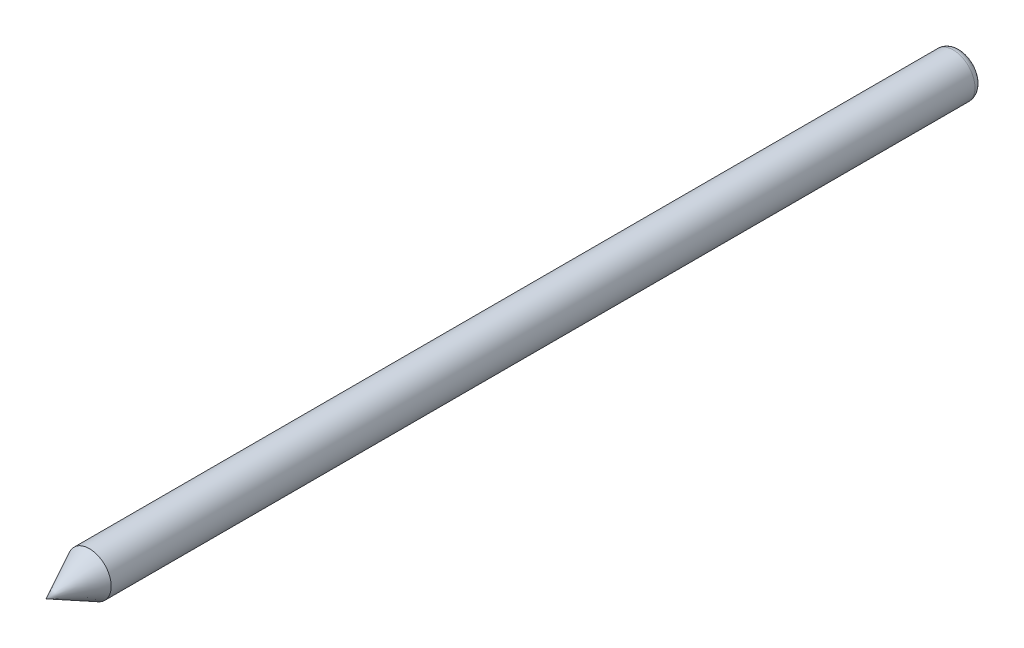
ISO-10303-21;
HEADER;
FILE_DESCRIPTION(('STEP AP214'),'2;1');
FILE_NAME('part.step','',(''),(''),'','','');
FILE_SCHEMA(('AUTOMOTIVE_DESIGN { 1 0 10303 214 1 1 1 1 }'));
ENDSEC;
DATA;
#1=APPLICATION_CONTEXT('core data for automotive mechanical design processes');
#2=APPLICATION_PROTOCOL_DEFINITION('international standard','automotive_design',2000,#1);
#3=PRODUCT_CONTEXT('',#1,'mechanical');
#4=PRODUCT('Part','Part','',(#3));
#5=PRODUCT_RELATED_PRODUCT_CATEGORY('part','',(#4));
#6=PRODUCT_DEFINITION_FORMATION('','',#4);
#7=PRODUCT_DEFINITION_CONTEXT('part definition',#1,'design');
#8=PRODUCT_DEFINITION('design','',#6,#7);
#9=PRODUCT_DEFINITION_SHAPE('','',#8);
#10=(LENGTH_UNIT() NAMED_UNIT(*) SI_UNIT(.MILLI.,.METRE.));
#11=(NAMED_UNIT(*) PLANE_ANGLE_UNIT() SI_UNIT($,.RADIAN.));
#12=(NAMED_UNIT(*) SI_UNIT($,.STERADIAN.) SOLID_ANGLE_UNIT());
#13=UNCERTAINTY_MEASURE_WITH_UNIT(LENGTH_MEASURE(1.E-05),#10,'distance_accuracy_value','');
#14=(GEOMETRIC_REPRESENTATION_CONTEXT(3) GLOBAL_UNCERTAINTY_ASSIGNED_CONTEXT((#13)) GLOBAL_UNIT_ASSIGNED_CONTEXT((#10,
#11,#12)) REPRESENTATION_CONTEXT('',''));
#15=CARTESIAN_POINT('',(0.,0.,0.));
#16=DIRECTION('',(0.,0.,1.));
#17=DIRECTION('',(1.,0.,0.));
#18=AXIS2_PLACEMENT_3D('',#15,#16,#17);
#19=CARTESIAN_POINT('',(0.,0.,120.));
#20=DIRECTION('',(0.,0.,-1.));
#21=DIRECTION('',(-1.,0.,0.));
#22=AXIS2_PLACEMENT_3D('',#19,#20,#21);
#23=CYLINDRICAL_SURFACE('',#22,3.);
#24=CARTESIAN_POINT('',(0.,0.,1.));
#25=DIRECTION('',(0.,0.,1.));
#26=DIRECTION('',(1.,0.,0.));
#27=AXIS2_PLACEMENT_3D('',#24,#25,#26);
#28=CIRCLE('',#27,3.);
#29=CARTESIAN_POINT('',(3.,0.,1.));
#30=VERTEX_POINT('',#29);
#31=EDGE_CURVE('E47',#30,#30,#28,.T.);
#32=ORIENTED_EDGE('',*,*,#31,.T.);
#33=EDGE_LOOP('',(#32));
#34=FACE_BOUND('',#33,.T.);
#35=CARTESIAN_POINT('',(0.,0.,120.));
#36=DIRECTION('',(0.,0.,1.));
#37=DIRECTION('',(1.,0.,0.));
#38=AXIS2_PLACEMENT_3D('',#35,#36,#37);
#39=CIRCLE('',#38,3.);
#40=CARTESIAN_POINT('',(3.,0.,120.));
#41=VERTEX_POINT('',#40);
#42=EDGE_CURVE('E72',#41,#41,#39,.T.);
#43=ORIENTED_EDGE('',*,*,#42,.F.);
#44=EDGE_LOOP('',(#43));
#45=FACE_BOUND('',#44,.T.);
#46=ADVANCED_FACE('F40',(#34,#45),#23,.T.);
#47=CARTESIAN_POINT('',(0.,0.,0.));
#48=DIRECTION('',(0.,0.,1.));
#49=DIRECTION('',(1.,0.,0.));
#50=AXIS2_PLACEMENT_3D('',#47,#48,#49);
#51=PLANE('',#50);
#52=CARTESIAN_POINT('',(0.,0.,0.));
#53=DIRECTION('',(0.,0.,1.));
#54=DIRECTION('',(1.,0.,0.));
#55=AXIS2_PLACEMENT_3D('',#52,#53,#54);
#56=CIRCLE('',#55,2.);
#57=CARTESIAN_POINT('',(2.,0.,0.));
#58=VERTEX_POINT('',#57);
#59=EDGE_CURVE('E11',#58,#58,#56,.F.);
#60=ORIENTED_EDGE('',*,*,#59,.T.);
#61=EDGE_LOOP('',(#60));
#62=FACE_BOUND('',#61,.T.);
#63=ADVANCED_FACE('F52',(#62),#51,.F.);
#64=CARTESIAN_POINT('',(0.,0.,125.982943807395));
#65=DIRECTION('',(0.,0.,-1.));
#66=DIRECTION('',(-1.,0.,0.));
#67=AXIS2_PLACEMENT_3D('',#64,#65,#66);
#68=CONICAL_SURFACE('',#67,0.,0.464787279808154);
#69=ORIENTED_EDGE('',*,*,#42,.T.);
#70=EDGE_LOOP('',(#69));
#71=FACE_BOUND('',#70,.T.);
#72=CARTESIAN_POINT('',(0.,0.,125.982943807395));
#73=VERTEX_POINT('',#72);
#74=VERTEX_LOOP('',#73);
#75=FACE_BOUND('',#74,.T.);
#76=ADVANCED_FACE('F50',(#71,#75),#68,.T.);
#77=CARTESIAN_POINT('',(0.,0.,1.));
#78=DIRECTION('',(0.,0.,1.));
#79=DIRECTION('',(1.,0.,0.));
#80=AXIS2_PLACEMENT_3D('',#77,#78,#79);
#81=TOROIDAL_SURFACE('',#80,2.,1.);
#82=ORIENTED_EDGE('',*,*,#59,.F.);
#83=EDGE_LOOP('',(#82));
#84=FACE_BOUND('',#83,.T.);
#85=ORIENTED_EDGE('',*,*,#31,.F.);
#86=EDGE_LOOP('',(#85));
#87=FACE_BOUND('',#86,.T.);
#88=ADVANCED_FACE('F42',(#84,#87),#81,.T.);
#89=CLOSED_SHELL('',(#46,#63,#76,#88));
#90=MANIFOLD_SOLID_BREP('B2',#89);
#91=ADVANCED_BREP_SHAPE_REPRESENTATION('',(#18,#90),#14);
#92=SHAPE_DEFINITION_REPRESENTATION(#9,#91);
ENDSEC;
END-ISO-10303-21;
